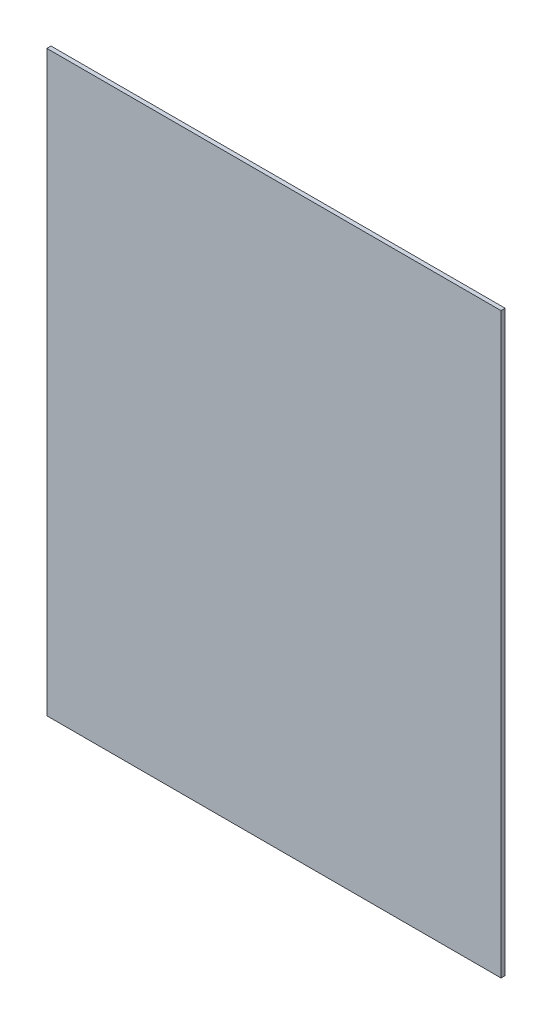
ISO-10303-21;
HEADER;
FILE_DESCRIPTION(('STEP AP214'),'2;1');
FILE_NAME('part.step','',(''),(''),'','','');
FILE_SCHEMA(('AUTOMOTIVE_DESIGN { 1 0 10303 214 1 1 1 1 }'));
ENDSEC;
DATA;
#1=APPLICATION_CONTEXT('core data for automotive mechanical design processes');
#2=APPLICATION_PROTOCOL_DEFINITION('international standard','automotive_design',2000,#1);
#3=PRODUCT_CONTEXT('',#1,'mechanical');
#4=PRODUCT('Part','Part','',(#3));
#5=PRODUCT_RELATED_PRODUCT_CATEGORY('part','',(#4));
#6=PRODUCT_DEFINITION_FORMATION('','',#4);
#7=PRODUCT_DEFINITION_CONTEXT('part definition',#1,'design');
#8=PRODUCT_DEFINITION('design','',#6,#7);
#9=PRODUCT_DEFINITION_SHAPE('','',#8);
#10=(LENGTH_UNIT() NAMED_UNIT(*) SI_UNIT(.MILLI.,.METRE.));
#11=(NAMED_UNIT(*) PLANE_ANGLE_UNIT() SI_UNIT($,.RADIAN.));
#12=(NAMED_UNIT(*) SI_UNIT($,.STERADIAN.) SOLID_ANGLE_UNIT());
#13=UNCERTAINTY_MEASURE_WITH_UNIT(LENGTH_MEASURE(1.E-05),#10,'distance_accuracy_value','');
#14=(GEOMETRIC_REPRESENTATION_CONTEXT(3) GLOBAL_UNCERTAINTY_ASSIGNED_CONTEXT((#13)) GLOBAL_UNIT_ASSIGNED_CONTEXT((#10,
#11,#12)) REPRESENTATION_CONTEXT('',''));
#15=CARTESIAN_POINT('',(0.,0.,0.));
#16=DIRECTION('',(0.,0.,1.));
#17=DIRECTION('',(1.,0.,0.));
#18=AXIS2_PLACEMENT_3D('',#15,#16,#17);
#19=CARTESIAN_POINT('',(0.,0.,-2.5));
#20=DIRECTION('',(0.,0.,1.));
#21=DIRECTION('',(1.,0.,0.));
#22=AXIS2_PLACEMENT_3D('',#19,#20,#21);
#23=PLANE('',#22);
#24=DIRECTION('',(0.,1.,0.));
#25=VECTOR('',#24,1.);
#26=CARTESIAN_POINT('',(-4.7,19.7,-2.5));
#27=LINE('',#26,#25);
#28=CARTESIAN_POINT('',(-4.7,19.2,-2.5));
#29=VERTEX_POINT('',#28);
#30=CARTESIAN_POINT('',(-4.7,5.2,-2.5));
#31=VERTEX_POINT('',#30);
#32=EDGE_CURVE('E55',#29,#31,#27,.F.);
#33=ORIENTED_EDGE('',*,*,#32,.T.);
#34=DIRECTION('',(-1.,0.,0.));
#35=VECTOR('',#34,1.);
#36=CARTESIAN_POINT('',(-5.2,5.2,-2.5));
#37=LINE('',#36,#35);
#38=CARTESIAN_POINT('',(6.3,5.2,-2.5));
#39=VERTEX_POINT('',#38);
#40=EDGE_CURVE('E76',#31,#39,#37,.F.);
#41=ORIENTED_EDGE('',*,*,#40,.T.);
#42=DIRECTION('',(0.,-1.,0.));
#43=VECTOR('',#42,1.);
#44=CARTESIAN_POINT('',(6.3,4.7,-2.5));
#45=LINE('',#44,#43);
#46=CARTESIAN_POINT('',(6.3,19.2,-2.5));
#47=VERTEX_POINT('',#46);
#48=EDGE_CURVE('E58',#39,#47,#45,.F.);
#49=ORIENTED_EDGE('',*,*,#48,.T.);
#50=DIRECTION('',(1.,0.,0.));
#51=VECTOR('',#50,1.);
#52=CARTESIAN_POINT('',(6.8,19.2,-2.5));
#53=LINE('',#52,#51);
#54=EDGE_CURVE('E20',#47,#29,#53,.F.);
#55=ORIENTED_EDGE('',*,*,#54,.T.);
#56=EDGE_LOOP('',(#33,#41,#49,#55));
#57=FACE_BOUND('',#56,.T.);
#58=ADVANCED_FACE('F17',(#57),#23,.T.);
#59=CARTESIAN_POINT('',(6.8,19.2,-2.6));
#60=DIRECTION('',(0.,-1.,0.));
#61=DIRECTION('',(1.,0.,0.));
#62=AXIS2_PLACEMENT_3D('',#59,#60,#61);
#63=PLANE('',#62);
#64=DIRECTION('',(0.,0.,1.));
#65=VECTOR('',#64,1.);
#66=CARTESIAN_POINT('',(6.3,19.2,-2.6));
#67=LINE('',#66,#65);
#68=CARTESIAN_POINT('',(6.3,19.2,-2.6));
#69=VERTEX_POINT('',#68);
#70=EDGE_CURVE('E78',#47,#69,#67,.F.);
#71=ORIENTED_EDGE('',*,*,#70,.T.);
#72=DIRECTION('',(1.,0.,0.));
#73=VECTOR('',#72,1.);
#74=CARTESIAN_POINT('',(0.,19.2,-2.6));
#75=LINE('',#74,#73);
#76=CARTESIAN_POINT('',(-4.7,19.2,-2.6));
#77=VERTEX_POINT('',#76);
#78=EDGE_CURVE('E73',#69,#77,#75,.F.);
#79=ORIENTED_EDGE('',*,*,#78,.T.);
#80=DIRECTION('',(0.,0.,1.));
#81=VECTOR('',#80,1.);
#82=CARTESIAN_POINT('',(-4.7,19.2,-2.6));
#83=LINE('',#82,#81);
#84=EDGE_CURVE('E63',#77,#29,#83,.T.);
#85=ORIENTED_EDGE('',*,*,#84,.T.);
#86=ORIENTED_EDGE('',*,*,#54,.F.);
#87=EDGE_LOOP('',(#71,#79,#85,#86));
#88=FACE_BOUND('',#87,.T.);
#89=ADVANCED_FACE('F72',(#88),#63,.F.);
#90=CARTESIAN_POINT('',(-4.7,19.7,-2.6));
#91=DIRECTION('',(1.,0.,0.));
#92=DIRECTION('',(0.,1.,0.));
#93=AXIS2_PLACEMENT_3D('',#90,#91,#92);
#94=PLANE('',#93);
#95=ORIENTED_EDGE('',*,*,#84,.F.);
#96=DIRECTION('',(0.,1.,0.));
#97=VECTOR('',#96,1.);
#98=CARTESIAN_POINT('',(-4.7,0.,-2.6));
#99=LINE('',#98,#97);
#100=CARTESIAN_POINT('',(-4.7,5.2,-2.6));
#101=VERTEX_POINT('',#100);
#102=EDGE_CURVE('E83',#77,#101,#99,.F.);
#103=ORIENTED_EDGE('',*,*,#102,.T.);
#104=DIRECTION('',(0.,0.,1.));
#105=VECTOR('',#104,1.);
#106=CARTESIAN_POINT('',(-4.7,5.2,-2.6));
#107=LINE('',#106,#105);
#108=EDGE_CURVE('E69',#101,#31,#107,.T.);
#109=ORIENTED_EDGE('',*,*,#108,.T.);
#110=ORIENTED_EDGE('',*,*,#32,.F.);
#111=EDGE_LOOP('',(#95,#103,#109,#110));
#112=FACE_BOUND('',#111,.T.);
#113=ADVANCED_FACE('F66',(#112),#94,.F.);
#114=CARTESIAN_POINT('',(-5.2,5.2,-2.6));
#115=DIRECTION('',(0.,1.,0.));
#116=DIRECTION('',(-1.,0.,0.));
#117=AXIS2_PLACEMENT_3D('',#114,#115,#116);
#118=PLANE('',#117);
#119=ORIENTED_EDGE('',*,*,#108,.F.);
#120=DIRECTION('',(1.,0.,0.));
#121=VECTOR('',#120,1.);
#122=CARTESIAN_POINT('',(0.,5.2,-2.6));
#123=LINE('',#122,#121);
#124=CARTESIAN_POINT('',(6.3,5.2,-2.6));
#125=VERTEX_POINT('',#124);
#126=EDGE_CURVE('E26',#101,#125,#123,.T.);
#127=ORIENTED_EDGE('',*,*,#126,.T.);
#128=DIRECTION('',(0.,0.,1.));
#129=VECTOR('',#128,1.);
#130=CARTESIAN_POINT('',(6.3,5.2,-2.6));
#131=LINE('',#130,#129);
#132=EDGE_CURVE('E34',#125,#39,#131,.T.);
#133=ORIENTED_EDGE('',*,*,#132,.T.);
#134=ORIENTED_EDGE('',*,*,#40,.F.);
#135=EDGE_LOOP('',(#119,#127,#133,#134));
#136=FACE_BOUND('',#135,.T.);
#137=ADVANCED_FACE('F88',(#136),#118,.F.);
#138=CARTESIAN_POINT('',(6.3,4.7,-2.6));
#139=DIRECTION('',(-1.,0.,0.));
#140=DIRECTION('',(0.,-1.,0.));
#141=AXIS2_PLACEMENT_3D('',#138,#139,#140);
#142=PLANE('',#141);
#143=ORIENTED_EDGE('',*,*,#132,.F.);
#144=DIRECTION('',(0.,1.,0.));
#145=VECTOR('',#144,1.);
#146=CARTESIAN_POINT('',(6.3,0.,-2.6));
#147=LINE('',#146,#145);
#148=EDGE_CURVE('E11',#125,#69,#147,.T.);
#149=ORIENTED_EDGE('',*,*,#148,.T.);
#150=ORIENTED_EDGE('',*,*,#70,.F.);
#151=ORIENTED_EDGE('',*,*,#48,.F.);
#152=EDGE_LOOP('',(#143,#149,#150,#151));
#153=FACE_BOUND('',#152,.T.);
#154=ADVANCED_FACE('F91',(#153),#142,.F.);
#155=CARTESIAN_POINT('',(0.,0.,-2.6));
#156=DIRECTION('',(0.,0.,1.));
#157=DIRECTION('',(1.,0.,0.));
#158=AXIS2_PLACEMENT_3D('',#155,#156,#157);
#159=PLANE('',#158);
#160=ORIENTED_EDGE('',*,*,#126,.F.);
#161=ORIENTED_EDGE('',*,*,#102,.F.);
#162=ORIENTED_EDGE('',*,*,#78,.F.);
#163=ORIENTED_EDGE('',*,*,#148,.F.);
#164=EDGE_LOOP('',(#160,#161,#162,#163));
#165=FACE_BOUND('',#164,.T.);
#166=ADVANCED_FACE('F90',(#165),#159,.F.);
#167=CLOSED_SHELL('',(#58,#89,#113,#137,#154,#166));
#168=MANIFOLD_SOLID_BREP('B1',#167);
#169=ADVANCED_BREP_SHAPE_REPRESENTATION('',(#18,#168),#14);
#170=SHAPE_DEFINITION_REPRESENTATION(#9,#169);
ENDSEC;
END-ISO-10303-21;
